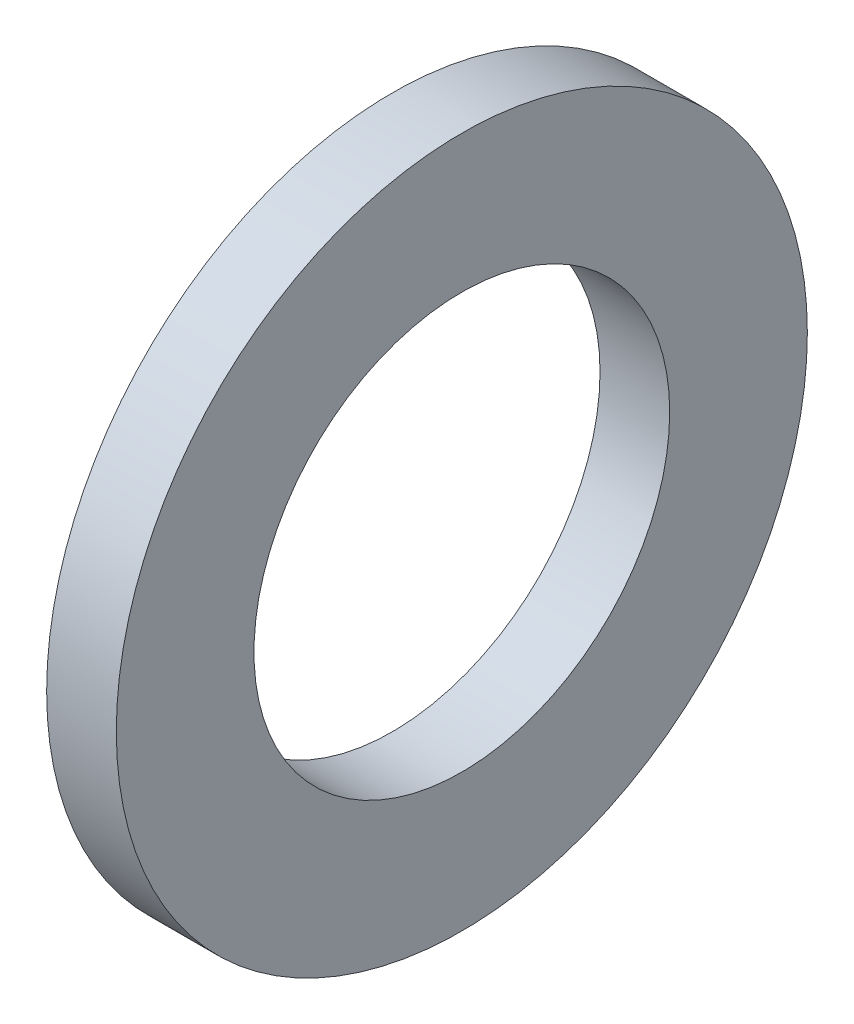
ISO-10303-21;
HEADER;
FILE_DESCRIPTION(('STEP AP214'),'2;1');
FILE_NAME('part.step','',(''),(''),'','','');
FILE_SCHEMA(('AUTOMOTIVE_DESIGN { 1 0 10303 214 1 1 1 1 }'));
ENDSEC;
DATA;
#1=APPLICATION_CONTEXT('core data for automotive mechanical design processes');
#2=APPLICATION_PROTOCOL_DEFINITION('international standard','automotive_design',2000,#1);
#3=PRODUCT_CONTEXT('',#1,'mechanical');
#4=PRODUCT('Part','Part','',(#3));
#5=PRODUCT_RELATED_PRODUCT_CATEGORY('part','',(#4));
#6=PRODUCT_DEFINITION_FORMATION('','',#4);
#7=PRODUCT_DEFINITION_CONTEXT('part definition',#1,'design');
#8=PRODUCT_DEFINITION('design','',#6,#7);
#9=PRODUCT_DEFINITION_SHAPE('','',#8);
#10=(LENGTH_UNIT() NAMED_UNIT(*) SI_UNIT(.MILLI.,.METRE.));
#11=(NAMED_UNIT(*) PLANE_ANGLE_UNIT() SI_UNIT($,.RADIAN.));
#12=(NAMED_UNIT(*) SI_UNIT($,.STERADIAN.) SOLID_ANGLE_UNIT());
#13=UNCERTAINTY_MEASURE_WITH_UNIT(LENGTH_MEASURE(1.E-05),#10,'distance_accuracy_value','');
#14=(GEOMETRIC_REPRESENTATION_CONTEXT(3) GLOBAL_UNCERTAINTY_ASSIGNED_CONTEXT((#13)) GLOBAL_UNIT_ASSIGNED_CONTEXT((#10,
#11,#12)) REPRESENTATION_CONTEXT('',''));
#15=CARTESIAN_POINT('',(0.,0.,0.));
#16=DIRECTION('',(0.,0.,1.));
#17=DIRECTION('',(1.,0.,0.));
#18=AXIS2_PLACEMENT_3D('',#15,#16,#17);
#19=CARTESIAN_POINT('',(3.2004,0.,0.));
#20=DIRECTION('',(1.,0.,0.));
#21=DIRECTION('',(0.,0.,-1.));
#22=AXIS2_PLACEMENT_3D('',#19,#20,#21);
#23=PLANE('',#22);
#24=CARTESIAN_POINT('',(3.2004,0.,0.));
#25=DIRECTION('',(1.,0.,0.));
#26=DIRECTION('',(0.,0.,-1.));
#27=AXIS2_PLACEMENT_3D('',#24,#25,#26);
#28=CIRCLE('',#27,15.875);
#29=CARTESIAN_POINT('',(3.2004,0.,-15.875));
#30=VERTEX_POINT('',#29);
#31=EDGE_CURVE('E10',#30,#30,#28,.T.);
#32=ORIENTED_EDGE('',*,*,#31,.T.);
#33=EDGE_LOOP('',(#32));
#34=FACE_BOUND('',#33,.T.);
#35=CARTESIAN_POINT('',(3.2004,0.,0.));
#36=DIRECTION('',(1.,0.,0.));
#37=DIRECTION('',(0.,0.,-1.));
#38=AXIS2_PLACEMENT_3D('',#35,#36,#37);
#39=CIRCLE('',#38,9.5504);
#40=CARTESIAN_POINT('',(3.2004,0.,-9.5504));
#41=VERTEX_POINT('',#40);
#42=EDGE_CURVE('E51',#41,#41,#39,.T.);
#43=ORIENTED_EDGE('',*,*,#42,.F.);
#44=EDGE_LOOP('',(#43));
#45=FACE_BOUND('',#44,.T.);
#46=ADVANCED_FACE('F38',(#34,#45),#23,.T.);
#47=CARTESIAN_POINT('',(0.,0.,0.));
#48=DIRECTION('',(1.,0.,0.));
#49=DIRECTION('',(0.,0.,-1.));
#50=AXIS2_PLACEMENT_3D('',#47,#48,#49);
#51=PLANE('',#50);
#52=CARTESIAN_POINT('',(0.,0.,0.));
#53=DIRECTION('',(1.,0.,0.));
#54=DIRECTION('',(0.,0.,-1.));
#55=AXIS2_PLACEMENT_3D('',#52,#53,#54);
#56=CIRCLE('',#55,15.875);
#57=CARTESIAN_POINT('',(0.,0.,-15.875));
#58=VERTEX_POINT('',#57);
#59=EDGE_CURVE('E42',#58,#58,#56,.T.);
#60=ORIENTED_EDGE('',*,*,#59,.F.);
#61=EDGE_LOOP('',(#60));
#62=FACE_BOUND('',#61,.T.);
#63=CARTESIAN_POINT('',(0.,0.,0.));
#64=DIRECTION('',(1.,0.,0.));
#65=DIRECTION('',(0.,0.,-1.));
#66=AXIS2_PLACEMENT_3D('',#63,#64,#65);
#67=CIRCLE('',#66,9.5504);
#68=CARTESIAN_POINT('',(0.,0.,-9.5504));
#69=VERTEX_POINT('',#68);
#70=EDGE_CURVE('E53',#69,#69,#67,.T.);
#71=ORIENTED_EDGE('',*,*,#70,.T.);
#72=EDGE_LOOP('',(#71));
#73=FACE_BOUND('',#72,.T.);
#74=ADVANCED_FACE('F65',(#62,#73),#51,.F.);
#75=CARTESIAN_POINT('',(3.2004,0.,0.));
#76=DIRECTION('',(-1.,0.,0.));
#77=DIRECTION('',(0.,0.,1.));
#78=AXIS2_PLACEMENT_3D('',#75,#76,#77);
#79=CYLINDRICAL_SURFACE('',#78,15.875);
#80=ORIENTED_EDGE('',*,*,#31,.F.);
#81=EDGE_LOOP('',(#80));
#82=FACE_BOUND('',#81,.T.);
#83=ORIENTED_EDGE('',*,*,#59,.T.);
#84=EDGE_LOOP('',(#83));
#85=FACE_BOUND('',#84,.T.);
#86=ADVANCED_FACE('F40',(#82,#85),#79,.T.);
#87=CARTESIAN_POINT('',(3.2004,0.,0.));
#88=DIRECTION('',(-1.,0.,0.));
#89=DIRECTION('',(0.,0.,1.));
#90=AXIS2_PLACEMENT_3D('',#87,#88,#89);
#91=CYLINDRICAL_SURFACE('',#90,9.5504);
#92=ORIENTED_EDGE('',*,*,#42,.T.);
#93=EDGE_LOOP('',(#92));
#94=FACE_BOUND('',#93,.T.);
#95=ORIENTED_EDGE('',*,*,#70,.F.);
#96=EDGE_LOOP('',(#95));
#97=FACE_BOUND('',#96,.T.);
#98=ADVANCED_FACE('F61',(#94,#97),#91,.F.);
#99=CLOSED_SHELL('',(#46,#74,#86,#98));
#100=MANIFOLD_SOLID_BREP('B2',#99);
#101=ADVANCED_BREP_SHAPE_REPRESENTATION('',(#18,#100),#14);
#102=SHAPE_DEFINITION_REPRESENTATION(#9,#101);
ENDSEC;
END-ISO-10303-21;
